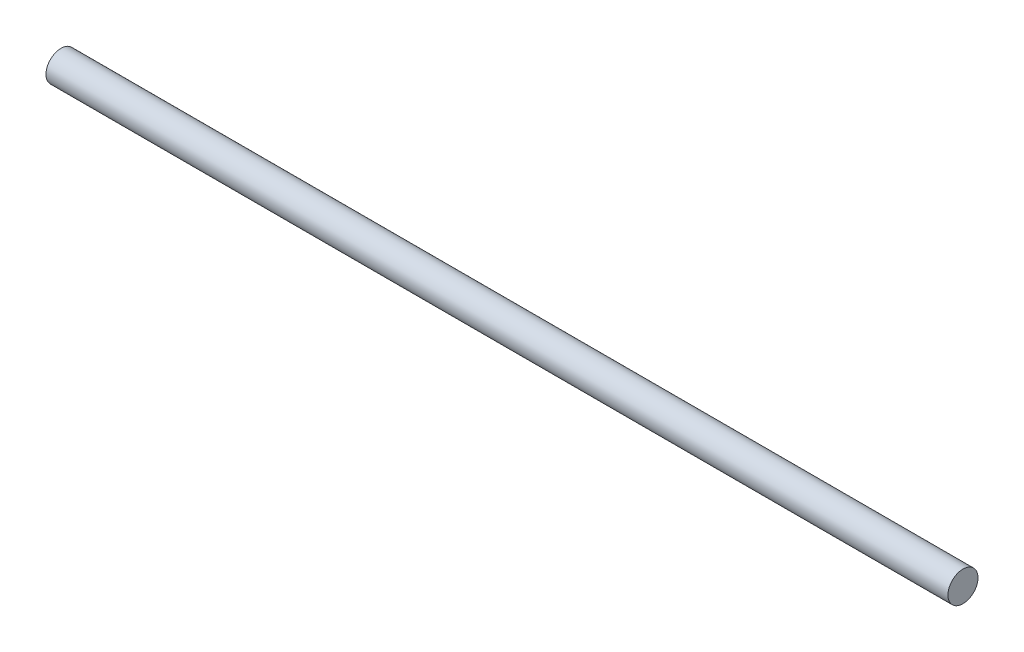
ISO-10303-21;
HEADER;
FILE_DESCRIPTION(('STEP AP214'),'2;1');
FILE_NAME('part.step','',(''),(''),'','','');
FILE_SCHEMA(('AUTOMOTIVE_DESIGN { 1 0 10303 214 1 1 1 1 }'));
ENDSEC;
DATA;
#1=APPLICATION_CONTEXT('core data for automotive mechanical design processes');
#2=APPLICATION_PROTOCOL_DEFINITION('international standard','automotive_design',2000,#1);
#3=PRODUCT_CONTEXT('',#1,'mechanical');
#4=PRODUCT('Part','Part','',(#3));
#5=PRODUCT_RELATED_PRODUCT_CATEGORY('part','',(#4));
#6=PRODUCT_DEFINITION_FORMATION('','',#4);
#7=PRODUCT_DEFINITION_CONTEXT('part definition',#1,'design');
#8=PRODUCT_DEFINITION('design','',#6,#7);
#9=PRODUCT_DEFINITION_SHAPE('','',#8);
#10=(LENGTH_UNIT() NAMED_UNIT(*) SI_UNIT(.MILLI.,.METRE.));
#11=(NAMED_UNIT(*) PLANE_ANGLE_UNIT() SI_UNIT($,.RADIAN.));
#12=(NAMED_UNIT(*) SI_UNIT($,.STERADIAN.) SOLID_ANGLE_UNIT());
#13=UNCERTAINTY_MEASURE_WITH_UNIT(LENGTH_MEASURE(1.E-05),#10,'distance_accuracy_value','');
#14=(GEOMETRIC_REPRESENTATION_CONTEXT(3) GLOBAL_UNCERTAINTY_ASSIGNED_CONTEXT((#13)) GLOBAL_UNIT_ASSIGNED_CONTEXT((#10,
#11,#12)) REPRESENTATION_CONTEXT('',''));
#15=CARTESIAN_POINT('',(0.,0.,0.));
#16=DIRECTION('',(0.,0.,1.));
#17=DIRECTION('',(1.,0.,0.));
#18=AXIS2_PLACEMENT_3D('',#15,#16,#17);
#19=CARTESIAN_POINT('',(150.,0.,0.));
#20=DIRECTION('',(-1.,0.,0.));
#21=DIRECTION('',(0.,0.,1.));
#22=AXIS2_PLACEMENT_3D('',#19,#20,#21);
#23=CYLINDRICAL_SURFACE('',#22,2.5);
#24=CARTESIAN_POINT('',(150.,0.,0.));
#25=DIRECTION('',(1.,0.,0.));
#26=DIRECTION('',(0.,0.,-1.));
#27=AXIS2_PLACEMENT_3D('',#24,#25,#26);
#28=CIRCLE('',#27,2.5);
#29=CARTESIAN_POINT('',(150.,0.,-2.5));
#30=VERTEX_POINT('',#29);
#31=EDGE_CURVE('E10',#30,#30,#28,.T.);
#32=ORIENTED_EDGE('',*,*,#31,.F.);
#33=EDGE_LOOP('',(#32));
#34=FACE_BOUND('',#33,.T.);
#35=CARTESIAN_POINT('',(0.,0.,0.));
#36=DIRECTION('',(1.,0.,0.));
#37=DIRECTION('',(0.,0.,-1.));
#38=AXIS2_PLACEMENT_3D('',#35,#36,#37);
#39=CIRCLE('',#38,2.5);
#40=CARTESIAN_POINT('',(0.,0.,-2.5));
#41=VERTEX_POINT('',#40);
#42=EDGE_CURVE('E46',#41,#41,#39,.T.);
#43=ORIENTED_EDGE('',*,*,#42,.T.);
#44=EDGE_LOOP('',(#43));
#45=FACE_BOUND('',#44,.T.);
#46=ADVANCED_FACE('F43',(#34,#45),#23,.T.);
#47=CARTESIAN_POINT('',(150.,0.,0.));
#48=DIRECTION('',(1.,0.,0.));
#49=DIRECTION('',(0.,0.,-1.));
#50=AXIS2_PLACEMENT_3D('',#47,#48,#49);
#51=PLANE('',#50);
#52=ORIENTED_EDGE('',*,*,#31,.T.);
#53=EDGE_LOOP('',(#52));
#54=FACE_BOUND('',#53,.T.);
#55=ADVANCED_FACE('F60',(#54),#51,.T.);
#56=CARTESIAN_POINT('',(0.,0.,0.));
#57=DIRECTION('',(1.,0.,0.));
#58=DIRECTION('',(0.,0.,-1.));
#59=AXIS2_PLACEMENT_3D('',#56,#57,#58);
#60=PLANE('',#59);
#61=ORIENTED_EDGE('',*,*,#42,.F.);
#62=EDGE_LOOP('',(#61));
#63=FACE_BOUND('',#62,.T.);
#64=ADVANCED_FACE('F58',(#63),#60,.F.);
#65=CLOSED_SHELL('',(#46,#55,#64));
#66=MANIFOLD_SOLID_BREP('B2',#65);
#67=ADVANCED_BREP_SHAPE_REPRESENTATION('',(#18,#66),#14);
#68=SHAPE_DEFINITION_REPRESENTATION(#9,#67);
ENDSEC;
END-ISO-10303-21;
